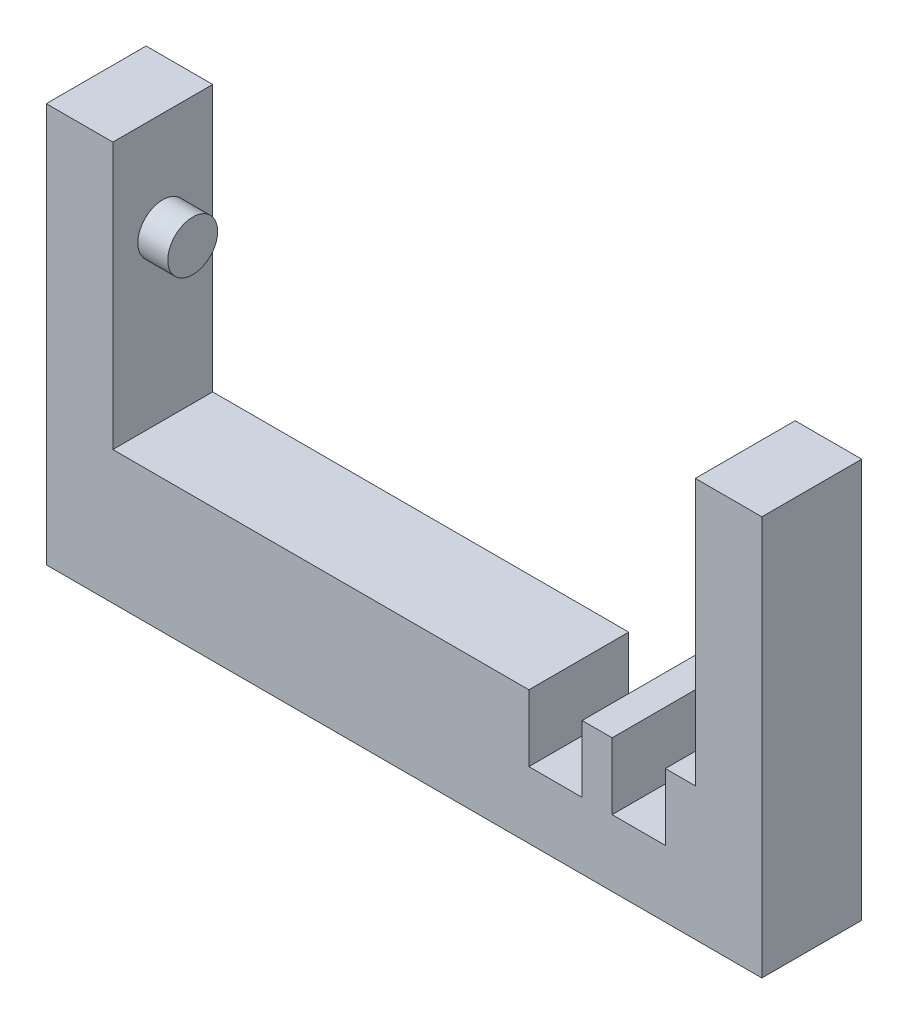
ISO-10303-21;
HEADER;
FILE_DESCRIPTION(('STEP AP214'),'2;1');
FILE_NAME('part.step','',(''),(''),'','','');
FILE_SCHEMA(('AUTOMOTIVE_DESIGN { 1 0 10303 214 1 1 1 1 }'));
ENDSEC;
DATA;
#1=APPLICATION_CONTEXT('core data for automotive mechanical design processes');
#2=APPLICATION_PROTOCOL_DEFINITION('international standard','automotive_design',2000,#1);
#3=PRODUCT_CONTEXT('',#1,'mechanical');
#4=PRODUCT('Part','Part','',(#3));
#5=PRODUCT_RELATED_PRODUCT_CATEGORY('part','',(#4));
#6=PRODUCT_DEFINITION_FORMATION('','',#4);
#7=PRODUCT_DEFINITION_CONTEXT('part definition',#1,'design');
#8=PRODUCT_DEFINITION('design','',#6,#7);
#9=PRODUCT_DEFINITION_SHAPE('','',#8);
#10=(LENGTH_UNIT() NAMED_UNIT(*) SI_UNIT(.MILLI.,.METRE.));
#11=(NAMED_UNIT(*) PLANE_ANGLE_UNIT() SI_UNIT($,.RADIAN.));
#12=(NAMED_UNIT(*) SI_UNIT($,.STERADIAN.) SOLID_ANGLE_UNIT());
#13=UNCERTAINTY_MEASURE_WITH_UNIT(LENGTH_MEASURE(1.E-05),#10,'distance_accuracy_value','');
#14=(GEOMETRIC_REPRESENTATION_CONTEXT(3) GLOBAL_UNCERTAINTY_ASSIGNED_CONTEXT((#13)) GLOBAL_UNIT_ASSIGNED_CONTEXT((#10,
#11,#12)) REPRESENTATION_CONTEXT('',''));
#15=CARTESIAN_POINT('',(0.,0.,0.));
#16=DIRECTION('',(0.,0.,1.));
#17=DIRECTION('',(1.,0.,0.));
#18=AXIS2_PLACEMENT_3D('',#15,#16,#17);
#19=CARTESIAN_POINT('',(0.,10.,-7.5));
#20=DIRECTION('',(0.,0.,-1.));
#21=DIRECTION('',(-1.,0.,0.));
#22=AXIS2_PLACEMENT_3D('',#19,#20,#21);
#23=PLANE('',#22);
#24=DIRECTION('',(-1.,0.,0.));
#25=VECTOR('',#24,1.);
#26=CARTESIAN_POINT('',(33.5,15.,-7.5));
#27=LINE('',#26,#25);
#28=CARTESIAN_POINT('',(33.5,15.,-7.5));
#29=VERTEX_POINT('',#28);
#30=CARTESIAN_POINT('',(29.,15.,-7.5));
#31=VERTEX_POINT('',#30);
#32=EDGE_CURVE('E57',#29,#31,#27,.T.);
#33=ORIENTED_EDGE('',*,*,#32,.F.);
#34=DIRECTION('',(0.,-1.,0.));
#35=VECTOR('',#34,1.);
#36=CARTESIAN_POINT('',(33.5,20.,-7.5));
#37=LINE('',#36,#35);
#38=CARTESIAN_POINT('',(33.5,10.,-7.5));
#39=VERTEX_POINT('',#38);
#40=EDGE_CURVE('E290',#29,#39,#37,.T.);
#41=ORIENTED_EDGE('',*,*,#40,.T.);
#42=DIRECTION('',(1.,0.,0.));
#43=VECTOR('',#42,1.);
#44=CARTESIAN_POINT('',(0.,10.,-7.5));
#45=LINE('',#44,#43);
#46=CARTESIAN_POINT('',(41.5,10.,-7.5));
#47=VERTEX_POINT('',#46);
#48=EDGE_CURVE('E303',#39,#47,#45,.T.);
#49=ORIENTED_EDGE('',*,*,#48,.T.);
#50=DIRECTION('',(0.,-1.,0.));
#51=VECTOR('',#50,1.);
#52=CARTESIAN_POINT('',(41.5,20.,-7.5));
#53=LINE('',#52,#51);
#54=CARTESIAN_POINT('',(41.5,20.,-7.5));
#55=VERTEX_POINT('',#54);
#56=EDGE_CURVE('E256',#55,#47,#53,.T.);
#57=ORIENTED_EDGE('',*,*,#56,.F.);
#58=DIRECTION('',(1.,0.,0.));
#59=VECTOR('',#58,1.);
#60=CARTESIAN_POINT('',(0.,20.,-7.49999999999995));
#61=LINE('',#60,#59);
#62=CARTESIAN_POINT('',(46.,20.,-7.5));
#63=VERTEX_POINT('',#62);
#64=EDGE_CURVE('E248',#55,#63,#61,.T.);
#65=ORIENTED_EDGE('',*,*,#64,.T.);
#66=DIRECTION('',(0.,-1.,0.));
#67=VECTOR('',#66,1.);
#68=CARTESIAN_POINT('',(46.,60.,-7.5));
#69=LINE('',#68,#67);
#70=CARTESIAN_POINT('',(46.,60.,-7.5));
#71=VERTEX_POINT('',#70);
#72=EDGE_CURVE('E215',#71,#63,#69,.T.);
#73=ORIENTED_EDGE('',*,*,#72,.F.);
#74=DIRECTION('',(1.,0.,0.));
#75=VECTOR('',#74,1.);
#76=CARTESIAN_POINT('',(0.,60.,-7.50000000000001));
#77=LINE('',#76,#75);
#78=CARTESIAN_POINT('',(56.,60.,-7.5));
#79=VERTEX_POINT('',#78);
#80=EDGE_CURVE('E207',#71,#79,#77,.T.);
#81=ORIENTED_EDGE('',*,*,#80,.T.);
#82=DIRECTION('',(0.,-1.,0.));
#83=VECTOR('',#82,1.);
#84=CARTESIAN_POINT('',(56.,60.,-7.5));
#85=LINE('',#84,#83);
#86=CARTESIAN_POINT('',(56.,0.,-7.5));
#87=VERTEX_POINT('',#86);
#88=EDGE_CURVE('E218',#79,#87,#85,.T.);
#89=ORIENTED_EDGE('',*,*,#88,.T.);
#90=DIRECTION('',(1.,0.,0.));
#91=VECTOR('',#90,1.);
#92=CARTESIAN_POINT('',(0.,0.,-7.5));
#93=LINE('',#92,#91);
#94=CARTESIAN_POINT('',(-51.5,0.,-7.5));
#95=VERTEX_POINT('',#94);
#96=EDGE_CURVE('E299',#95,#87,#93,.T.);
#97=ORIENTED_EDGE('',*,*,#96,.F.);
#98=DIRECTION('',(0.,-1.,0.));
#99=VECTOR('',#98,1.);
#100=CARTESIAN_POINT('',(-51.5,60.,-7.5));
#101=LINE('',#100,#99);
#102=CARTESIAN_POINT('',(-51.5,60.,-7.5));
#103=VERTEX_POINT('',#102);
#104=EDGE_CURVE('E361',#103,#95,#101,.T.);
#105=ORIENTED_EDGE('',*,*,#104,.F.);
#106=DIRECTION('',(-1.,0.,0.));
#107=VECTOR('',#106,1.);
#108=CARTESIAN_POINT('',(0.,60.,-7.5));
#109=LINE('',#108,#107);
#110=CARTESIAN_POINT('',(-41.5,60.,-7.5));
#111=VERTEX_POINT('',#110);
#112=EDGE_CURVE('E185',#111,#103,#109,.T.);
#113=ORIENTED_EDGE('',*,*,#112,.F.);
#114=DIRECTION('',(0.,-1.,0.));
#115=VECTOR('',#114,1.);
#116=CARTESIAN_POINT('',(-41.5,60.,-7.5));
#117=LINE('',#116,#115);
#118=CARTESIAN_POINT('',(-41.5,20.,-7.5));
#119=VERTEX_POINT('',#118);
#120=EDGE_CURVE('E198',#111,#119,#117,.T.);
#121=ORIENTED_EDGE('',*,*,#120,.T.);
#122=DIRECTION('',(1.,0.,0.));
#123=VECTOR('',#122,1.);
#124=CARTESIAN_POINT('',(0.,20.,-7.5));
#125=LINE('',#124,#123);
#126=CARTESIAN_POINT('',(21.,20.,-7.5));
#127=VERTEX_POINT('',#126);
#128=EDGE_CURVE('E262',#119,#127,#125,.T.);
#129=ORIENTED_EDGE('',*,*,#128,.T.);
#130=DIRECTION('',(0.,-1.,0.));
#131=VECTOR('',#130,1.);
#132=CARTESIAN_POINT('',(21.,20.,-7.5));
#133=LINE('',#132,#131);
#134=CARTESIAN_POINT('',(21.,10.,-7.5));
#135=VERTEX_POINT('',#134);
#136=EDGE_CURVE('E272',#127,#135,#133,.T.);
#137=ORIENTED_EDGE('',*,*,#136,.T.);
#138=DIRECTION('',(1.,0.,0.));
#139=VECTOR('',#138,1.);
#140=CARTESIAN_POINT('',(0.,10.,-7.5));
#141=LINE('',#140,#139);
#142=CARTESIAN_POINT('',(29.,10.,-7.5));
#143=VERTEX_POINT('',#142);
#144=EDGE_CURVE('E275',#135,#143,#141,.T.);
#145=ORIENTED_EDGE('',*,*,#144,.T.);
#146=DIRECTION('',(0.,-1.,0.));
#147=VECTOR('',#146,1.);
#148=CARTESIAN_POINT('',(29.,20.,-7.5));
#149=LINE('',#148,#147);
#150=EDGE_CURVE('E297',#31,#143,#149,.T.);
#151=ORIENTED_EDGE('',*,*,#150,.F.);
#152=EDGE_LOOP('',(#33,#41,#49,#57,#65,#73,#81,#89,#97,#105,#113,#121,#129,#137,#145,#151));
#153=FACE_BOUND('',#152,.T.);
#154=ADVANCED_FACE('F41',(#153),#23,.T.);
#155=CARTESIAN_POINT('',(0.,10.,7.5));
#156=DIRECTION('',(0.,0.,-1.));
#157=DIRECTION('',(-1.,0.,0.));
#158=AXIS2_PLACEMENT_3D('',#155,#156,#157);
#159=PLANE('',#158);
#160=DIRECTION('',(1.,0.,0.));
#161=VECTOR('',#160,1.);
#162=CARTESIAN_POINT('',(0.,0.,7.5));
#163=LINE('',#162,#161);
#164=CARTESIAN_POINT('',(-51.5,0.,7.5));
#165=VERTEX_POINT('',#164);
#166=CARTESIAN_POINT('',(56.,0.,7.5));
#167=VERTEX_POINT('',#166);
#168=EDGE_CURVE('E304',#165,#167,#163,.T.);
#169=ORIENTED_EDGE('',*,*,#168,.T.);
#170=DIRECTION('',(0.,-1.,0.));
#171=VECTOR('',#170,1.);
#172=CARTESIAN_POINT('',(56.,60.,7.5));
#173=LINE('',#172,#171);
#174=CARTESIAN_POINT('',(56.,60.,7.5));
#175=VERTEX_POINT('',#174);
#176=EDGE_CURVE('E221',#175,#167,#173,.T.);
#177=ORIENTED_EDGE('',*,*,#176,.F.);
#178=DIRECTION('',(-1.,0.,0.));
#179=VECTOR('',#178,1.);
#180=CARTESIAN_POINT('',(0.,60.,7.50000000000001));
#181=LINE('',#180,#179);
#182=CARTESIAN_POINT('',(46.,60.,7.5));
#183=VERTEX_POINT('',#182);
#184=EDGE_CURVE('E196',#175,#183,#181,.T.);
#185=ORIENTED_EDGE('',*,*,#184,.T.);
#186=DIRECTION('',(0.,-1.,0.));
#187=VECTOR('',#186,1.);
#188=CARTESIAN_POINT('',(46.,60.,7.5));
#189=LINE('',#188,#187);
#190=CARTESIAN_POINT('',(46.,20.,7.5));
#191=VERTEX_POINT('',#190);
#192=EDGE_CURVE('E211',#183,#191,#189,.T.);
#193=ORIENTED_EDGE('',*,*,#192,.T.);
#194=DIRECTION('',(-1.,0.,0.));
#195=VECTOR('',#194,1.);
#196=CARTESIAN_POINT('',(0.,20.,7.5));
#197=LINE('',#196,#195);
#198=CARTESIAN_POINT('',(41.5,20.,7.5));
#199=VERTEX_POINT('',#198);
#200=EDGE_CURVE('E242',#191,#199,#197,.T.);
#201=ORIENTED_EDGE('',*,*,#200,.T.);
#202=DIRECTION('',(0.,-1.,0.));
#203=VECTOR('',#202,1.);
#204=CARTESIAN_POINT('',(41.5,20.,7.5));
#205=LINE('',#204,#203);
#206=CARTESIAN_POINT('',(41.5,10.,7.5));
#207=VERTEX_POINT('',#206);
#208=EDGE_CURVE('E253',#199,#207,#205,.T.);
#209=ORIENTED_EDGE('',*,*,#208,.T.);
#210=DIRECTION('',(1.,0.,0.));
#211=VECTOR('',#210,1.);
#212=CARTESIAN_POINT('',(0.,10.,7.5));
#213=LINE('',#212,#211);
#214=CARTESIAN_POINT('',(33.5,10.,7.5));
#215=VERTEX_POINT('',#214);
#216=EDGE_CURVE('E11',#215,#207,#213,.T.);
#217=ORIENTED_EDGE('',*,*,#216,.F.);
#218=DIRECTION('',(0.,-1.,0.));
#219=VECTOR('',#218,1.);
#220=CARTESIAN_POINT('',(33.5,20.,7.5));
#221=LINE('',#220,#219);
#222=CARTESIAN_POINT('',(33.5,20.,7.5));
#223=VERTEX_POINT('',#222);
#224=EDGE_CURVE('E292',#223,#215,#221,.T.);
#225=ORIENTED_EDGE('',*,*,#224,.F.);
#226=DIRECTION('',(1.,0.,0.));
#227=VECTOR('',#226,1.);
#228=CARTESIAN_POINT('',(0.,20.,7.5));
#229=LINE('',#228,#227);
#230=CARTESIAN_POINT('',(29.,20.,7.5));
#231=VERTEX_POINT('',#230);
#232=EDGE_CURVE('E285',#231,#223,#229,.T.);
#233=ORIENTED_EDGE('',*,*,#232,.F.);
#234=DIRECTION('',(0.,-1.,0.));
#235=VECTOR('',#234,1.);
#236=CARTESIAN_POINT('',(29.,20.,7.5));
#237=LINE('',#236,#235);
#238=CARTESIAN_POINT('',(29.,10.,7.5));
#239=VERTEX_POINT('',#238);
#240=EDGE_CURVE('E294',#231,#239,#237,.T.);
#241=ORIENTED_EDGE('',*,*,#240,.T.);
#242=DIRECTION('',(1.,0.,0.));
#243=VECTOR('',#242,1.);
#244=CARTESIAN_POINT('',(0.,10.,7.5));
#245=LINE('',#244,#243);
#246=CARTESIAN_POINT('',(21.,10.,7.5));
#247=VERTEX_POINT('',#246);
#248=EDGE_CURVE('E65',#247,#239,#245,.T.);
#249=ORIENTED_EDGE('',*,*,#248,.F.);
#250=DIRECTION('',(0.,-1.,0.));
#251=VECTOR('',#250,1.);
#252=CARTESIAN_POINT('',(21.,20.,7.5));
#253=LINE('',#252,#251);
#254=CARTESIAN_POINT('',(21.,20.,7.5));
#255=VERTEX_POINT('',#254);
#256=EDGE_CURVE('E270',#255,#247,#253,.T.);
#257=ORIENTED_EDGE('',*,*,#256,.F.);
#258=DIRECTION('',(1.,0.,0.));
#259=VECTOR('',#258,1.);
#260=CARTESIAN_POINT('',(0.,20.,7.5));
#261=LINE('',#260,#259);
#262=CARTESIAN_POINT('',(-41.5,20.,7.5));
#263=VERTEX_POINT('',#262);
#264=EDGE_CURVE('E268',#263,#255,#261,.T.);
#265=ORIENTED_EDGE('',*,*,#264,.F.);
#266=DIRECTION('',(0.,-1.,0.));
#267=VECTOR('',#266,1.);
#268=CARTESIAN_POINT('',(-41.5,60.,7.5));
#269=LINE('',#268,#267);
#270=CARTESIAN_POINT('',(-41.5,60.,7.5));
#271=VERTEX_POINT('',#270);
#272=EDGE_CURVE('E175',#271,#263,#269,.T.);
#273=ORIENTED_EDGE('',*,*,#272,.F.);
#274=DIRECTION('',(1.,0.,0.));
#275=VECTOR('',#274,1.);
#276=CARTESIAN_POINT('',(0.,60.,7.5));
#277=LINE('',#276,#275);
#278=CARTESIAN_POINT('',(-51.5,60.,7.5));
#279=VERTEX_POINT('',#278);
#280=EDGE_CURVE('E168',#279,#271,#277,.T.);
#281=ORIENTED_EDGE('',*,*,#280,.F.);
#282=DIRECTION('',(0.,-1.,0.));
#283=VECTOR('',#282,1.);
#284=CARTESIAN_POINT('',(-51.5,60.,7.5));
#285=LINE('',#284,#283);
#286=EDGE_CURVE('E172',#279,#165,#285,.T.);
#287=ORIENTED_EDGE('',*,*,#286,.T.);
#288=EDGE_LOOP('',(#169,#177,#185,#193,#201,#209,#217,#225,#233,#241,#249,#257,#265,#273,#281,#287));
#289=FACE_BOUND('',#288,.T.);
#290=ADVANCED_FACE('F170',(#289),#159,.F.);
#291=CARTESIAN_POINT('',(0.,10.,0.));
#292=DIRECTION('',(0.,1.,0.));
#293=DIRECTION('',(0.,0.,1.));
#294=AXIS2_PLACEMENT_3D('',#291,#292,#293);
#295=PLANE('',#294);
#296=DIRECTION('',(0.,0.,1.));
#297=VECTOR('',#296,1.);
#298=CARTESIAN_POINT('',(41.5,10.,0.));
#299=LINE('',#298,#297);
#300=EDGE_CURVE('E300',#47,#207,#299,.T.);
#301=ORIENTED_EDGE('',*,*,#300,.F.);
#302=ORIENTED_EDGE('',*,*,#48,.F.);
#303=DIRECTION('',(0.,0.,1.));
#304=VECTOR('',#303,1.);
#305=CARTESIAN_POINT('',(33.5,10.,0.));
#306=LINE('',#305,#304);
#307=EDGE_CURVE('E49',#39,#215,#306,.T.);
#308=ORIENTED_EDGE('',*,*,#307,.T.);
#309=ORIENTED_EDGE('',*,*,#216,.T.);
#310=EDGE_LOOP('',(#301,#302,#308,#309));
#311=FACE_BOUND('',#310,.T.);
#312=ADVANCED_FACE('F335',(#311),#295,.T.);
#313=CARTESIAN_POINT('',(0.,0.,0.));
#314=DIRECTION('',(0.,1.,0.));
#315=DIRECTION('',(0.,0.,1.));
#316=AXIS2_PLACEMENT_3D('',#313,#314,#315);
#317=PLANE('',#316);
#318=ORIENTED_EDGE('',*,*,#96,.T.);
#319=DIRECTION('',(0.,0.,1.));
#320=VECTOR('',#319,1.);
#321=CARTESIAN_POINT('',(56.,0.,0.));
#322=LINE('',#321,#320);
#323=EDGE_CURVE('E193',#87,#167,#322,.T.);
#324=ORIENTED_EDGE('',*,*,#323,.T.);
#325=ORIENTED_EDGE('',*,*,#168,.F.);
#326=DIRECTION('',(0.,0.,1.));
#327=VECTOR('',#326,1.);
#328=CARTESIAN_POINT('',(-51.5,0.,0.));
#329=LINE('',#328,#327);
#330=EDGE_CURVE('E189',#95,#165,#329,.T.);
#331=ORIENTED_EDGE('',*,*,#330,.F.);
#332=EDGE_LOOP('',(#318,#324,#325,#331));
#333=FACE_BOUND('',#332,.T.);
#334=ADVANCED_FACE('F315',(#333),#317,.F.);
#335=CARTESIAN_POINT('',(33.5,20.,0.));
#336=DIRECTION('',(1.,0.,0.));
#337=DIRECTION('',(0.,0.,-1.));
#338=AXIS2_PLACEMENT_3D('',#335,#336,#337);
#339=PLANE('',#338);
#340=CARTESIAN_POINT('',(33.5,17.5,-10.));
#341=DIRECTION('',(1.,0.,0.));
#342=DIRECTION('',(0.,0.,-1.));
#343=AXIS2_PLACEMENT_3D('',#340,#341,#342);
#344=CIRCLE('',#343,1.5);
#345=CARTESIAN_POINT('',(33.5,17.5,-11.5));
#346=VERTEX_POINT('',#345);
#347=EDGE_CURVE('E373',#346,#346,#344,.T.);
#348=ORIENTED_EDGE('',*,*,#347,.F.);
#349=EDGE_LOOP('',(#348));
#350=FACE_BOUND('',#349,.T.);
#351=ORIENTED_EDGE('',*,*,#307,.F.);
#352=ORIENTED_EDGE('',*,*,#40,.F.);
#353=DIRECTION('',(0.,0.,1.));
#354=VECTOR('',#353,1.);
#355=CARTESIAN_POINT('',(33.5,15.,-12.5));
#356=LINE('',#355,#354);
#357=CARTESIAN_POINT('',(33.5,15.,-12.5));
#358=VERTEX_POINT('',#357);
#359=EDGE_CURVE('E239',#358,#29,#356,.T.);
#360=ORIENTED_EDGE('',*,*,#359,.F.);
#361=DIRECTION('',(0.,-1.,0.));
#362=VECTOR('',#361,1.);
#363=CARTESIAN_POINT('',(33.5,20.,-12.5));
#364=LINE('',#363,#362);
#365=CARTESIAN_POINT('',(33.5,20.,-12.5));
#366=VERTEX_POINT('',#365);
#367=EDGE_CURVE('E224',#366,#358,#364,.T.);
#368=ORIENTED_EDGE('',*,*,#367,.F.);
#369=DIRECTION('',(0.,0.,1.));
#370=VECTOR('',#369,1.);
#371=CARTESIAN_POINT('',(33.5,20.,0.));
#372=LINE('',#371,#370);
#373=EDGE_CURVE('E287',#366,#223,#372,.T.);
#374=ORIENTED_EDGE('',*,*,#373,.T.);
#375=ORIENTED_EDGE('',*,*,#224,.T.);
#376=EDGE_LOOP('',(#351,#352,#360,#368,#374,#375));
#377=FACE_BOUND('',#376,.T.);
#378=ADVANCED_FACE('F338',(#350,#377),#339,.T.);
#379=CARTESIAN_POINT('',(29.,20.,0.));
#380=DIRECTION('',(1.,0.,0.));
#381=DIRECTION('',(0.,0.,-1.));
#382=AXIS2_PLACEMENT_3D('',#379,#380,#381);
#383=PLANE('',#382);
#384=CARTESIAN_POINT('',(29.,17.5,-10.));
#385=DIRECTION('',(1.,0.,0.));
#386=DIRECTION('',(0.,0.,-1.));
#387=AXIS2_PLACEMENT_3D('',#384,#385,#386);
#388=CIRCLE('',#387,1.5);
#389=CARTESIAN_POINT('',(29.,17.5,-11.5));
#390=VERTEX_POINT('',#389);
#391=EDGE_CURVE('E44',#390,#390,#388,.T.);
#392=ORIENTED_EDGE('',*,*,#391,.T.);
#393=EDGE_LOOP('',(#392));
#394=FACE_BOUND('',#393,.T.);
#395=DIRECTION('',(0.,0.,1.));
#396=VECTOR('',#395,1.);
#397=CARTESIAN_POINT('',(29.,20.,0.));
#398=LINE('',#397,#396);
#399=CARTESIAN_POINT('',(29.,20.,-12.5));
#400=VERTEX_POINT('',#399);
#401=EDGE_CURVE('E283',#400,#231,#398,.T.);
#402=ORIENTED_EDGE('',*,*,#401,.F.);
#403=DIRECTION('',(0.,1.,0.));
#404=VECTOR('',#403,1.);
#405=CARTESIAN_POINT('',(29.,20.,-12.5));
#406=LINE('',#405,#404);
#407=CARTESIAN_POINT('',(29.,15.,-12.5));
#408=VERTEX_POINT('',#407);
#409=EDGE_CURVE('E229',#408,#400,#406,.T.);
#410=ORIENTED_EDGE('',*,*,#409,.F.);
#411=DIRECTION('',(0.,0.,1.));
#412=VECTOR('',#411,1.);
#413=CARTESIAN_POINT('',(29.,15.,-12.5));
#414=LINE('',#413,#412);
#415=EDGE_CURVE('E235',#408,#31,#414,.T.);
#416=ORIENTED_EDGE('',*,*,#415,.T.);
#417=ORIENTED_EDGE('',*,*,#150,.T.);
#418=DIRECTION('',(0.,0.,1.));
#419=VECTOR('',#418,1.);
#420=CARTESIAN_POINT('',(29.,10.,0.));
#421=LINE('',#420,#419);
#422=EDGE_CURVE('E281',#143,#239,#421,.T.);
#423=ORIENTED_EDGE('',*,*,#422,.T.);
#424=ORIENTED_EDGE('',*,*,#240,.F.);
#425=EDGE_LOOP('',(#402,#410,#416,#417,#423,#424));
#426=FACE_BOUND('',#425,.T.);
#427=ADVANCED_FACE('F349',(#394,#426),#383,.F.);
#428=CARTESIAN_POINT('',(0.,20.,0.));
#429=DIRECTION('',(0.,1.,0.));
#430=DIRECTION('',(0.,0.,1.));
#431=AXIS2_PLACEMENT_3D('',#428,#429,#430);
#432=PLANE('',#431);
#433=ORIENTED_EDGE('',*,*,#373,.F.);
#434=DIRECTION('',(1.,0.,0.));
#435=VECTOR('',#434,1.);
#436=CARTESIAN_POINT('',(33.5,20.,-12.5));
#437=LINE('',#436,#435);
#438=EDGE_CURVE('E232',#400,#366,#437,.T.);
#439=ORIENTED_EDGE('',*,*,#438,.F.);
#440=ORIENTED_EDGE('',*,*,#401,.T.);
#441=ORIENTED_EDGE('',*,*,#232,.T.);
#442=EDGE_LOOP('',(#433,#439,#440,#441));
#443=FACE_BOUND('',#442,.T.);
#444=ADVANCED_FACE('F343',(#443),#432,.T.);
#445=CARTESIAN_POINT('',(0.,10.,0.));
#446=DIRECTION('',(0.,1.,0.));
#447=DIRECTION('',(0.,0.,1.));
#448=AXIS2_PLACEMENT_3D('',#445,#446,#447);
#449=PLANE('',#448);
#450=ORIENTED_EDGE('',*,*,#144,.F.);
#451=DIRECTION('',(0.,0.,1.));
#452=VECTOR('',#451,1.);
#453=CARTESIAN_POINT('',(21.,10.,0.));
#454=LINE('',#453,#452);
#455=EDGE_CURVE('E278',#135,#247,#454,.T.);
#456=ORIENTED_EDGE('',*,*,#455,.T.);
#457=ORIENTED_EDGE('',*,*,#248,.T.);
#458=ORIENTED_EDGE('',*,*,#422,.F.);
#459=EDGE_LOOP('',(#450,#456,#457,#458));
#460=FACE_BOUND('',#459,.T.);
#461=ADVANCED_FACE('F409',(#460),#449,.T.);
#462=CARTESIAN_POINT('',(21.,20.,0.));
#463=DIRECTION('',(1.,0.,0.));
#464=DIRECTION('',(0.,0.,-1.));
#465=AXIS2_PLACEMENT_3D('',#462,#463,#464);
#466=PLANE('',#465);
#467=ORIENTED_EDGE('',*,*,#455,.F.);
#468=ORIENTED_EDGE('',*,*,#136,.F.);
#469=DIRECTION('',(0.,0.,1.));
#470=VECTOR('',#469,1.);
#471=CARTESIAN_POINT('',(21.,20.,0.));
#472=LINE('',#471,#470);
#473=EDGE_CURVE('E259',#127,#255,#472,.T.);
#474=ORIENTED_EDGE('',*,*,#473,.T.);
#475=ORIENTED_EDGE('',*,*,#256,.T.);
#476=EDGE_LOOP('',(#467,#468,#474,#475));
#477=FACE_BOUND('',#476,.T.);
#478=ADVANCED_FACE('F354',(#477),#466,.T.);
#479=CARTESIAN_POINT('',(0.,20.,0.));
#480=DIRECTION('',(0.,1.,0.));
#481=DIRECTION('',(0.,0.,1.));
#482=AXIS2_PLACEMENT_3D('',#479,#480,#481);
#483=PLANE('',#482);
#484=ORIENTED_EDGE('',*,*,#473,.F.);
#485=ORIENTED_EDGE('',*,*,#128,.F.);
#486=DIRECTION('',(0.,0.,1.));
#487=VECTOR('',#486,1.);
#488=CARTESIAN_POINT('',(-41.5,20.,0.));
#489=LINE('',#488,#487);
#490=EDGE_CURVE('E265',#119,#263,#489,.T.);
#491=ORIENTED_EDGE('',*,*,#490,.T.);
#492=ORIENTED_EDGE('',*,*,#264,.T.);
#493=EDGE_LOOP('',(#484,#485,#491,#492));
#494=FACE_BOUND('',#493,.T.);
#495=ADVANCED_FACE('F357',(#494),#483,.T.);
#496=CARTESIAN_POINT('',(41.5,20.,0.));
#497=DIRECTION('',(1.,0.,0.));
#498=DIRECTION('',(0.,0.,-1.));
#499=AXIS2_PLACEMENT_3D('',#496,#497,#498);
#500=PLANE('',#499);
#501=ORIENTED_EDGE('',*,*,#56,.T.);
#502=ORIENTED_EDGE('',*,*,#300,.T.);
#503=ORIENTED_EDGE('',*,*,#208,.F.);
#504=DIRECTION('',(0.,0.,1.));
#505=VECTOR('',#504,1.);
#506=CARTESIAN_POINT('',(41.5,20.,0.));
#507=LINE('',#506,#505);
#508=EDGE_CURVE('E251',#55,#199,#507,.T.);
#509=ORIENTED_EDGE('',*,*,#508,.F.);
#510=EDGE_LOOP('',(#501,#502,#503,#509));
#511=FACE_BOUND('',#510,.T.);
#512=ADVANCED_FACE('F330',(#511),#500,.F.);
#513=CARTESIAN_POINT('',(0.,20.,0.));
#514=DIRECTION('',(0.,1.,0.));
#515=DIRECTION('',(0.,0.,1.));
#516=AXIS2_PLACEMENT_3D('',#513,#514,#515);
#517=PLANE('',#516);
#518=ORIENTED_EDGE('',*,*,#200,.F.);
#519=DIRECTION('',(0.,0.,1.));
#520=VECTOR('',#519,1.);
#521=CARTESIAN_POINT('',(46.,20.,0.));
#522=LINE('',#521,#520);
#523=EDGE_CURVE('E245',#63,#191,#522,.T.);
#524=ORIENTED_EDGE('',*,*,#523,.F.);
#525=ORIENTED_EDGE('',*,*,#64,.F.);
#526=ORIENTED_EDGE('',*,*,#508,.T.);
#527=EDGE_LOOP('',(#518,#524,#525,#526));
#528=FACE_BOUND('',#527,.T.);
#529=ADVANCED_FACE('F325',(#528),#517,.T.);
#530=CARTESIAN_POINT('',(33.5,15.,-12.5));
#531=DIRECTION('',(0.,1.,0.));
#532=DIRECTION('',(0.,0.,1.));
#533=AXIS2_PLACEMENT_3D('',#530,#531,#532);
#534=PLANE('',#533);
#535=ORIENTED_EDGE('',*,*,#32,.T.);
#536=ORIENTED_EDGE('',*,*,#415,.F.);
#537=DIRECTION('',(-1.,0.,0.));
#538=VECTOR('',#537,1.);
#539=CARTESIAN_POINT('',(33.5,15.,-12.5));
#540=LINE('',#539,#538);
#541=EDGE_CURVE('E227',#358,#408,#540,.T.);
#542=ORIENTED_EDGE('',*,*,#541,.F.);
#543=ORIENTED_EDGE('',*,*,#359,.T.);
#544=EDGE_LOOP('',(#535,#536,#542,#543));
#545=FACE_BOUND('',#544,.T.);
#546=ADVANCED_FACE('F420',(#545),#534,.F.);
#547=CARTESIAN_POINT('',(0.,0.,-12.5));
#548=DIRECTION('',(0.,0.,-1.));
#549=DIRECTION('',(-1.,0.,0.));
#550=AXIS2_PLACEMENT_3D('',#547,#548,#549);
#551=PLANE('',#550);
#552=ORIENTED_EDGE('',*,*,#367,.T.);
#553=ORIENTED_EDGE('',*,*,#541,.T.);
#554=ORIENTED_EDGE('',*,*,#409,.T.);
#555=ORIENTED_EDGE('',*,*,#438,.T.);
#556=EDGE_LOOP('',(#552,#553,#554,#555));
#557=FACE_BOUND('',#556,.T.);
#558=ADVANCED_FACE('F345',(#557),#551,.T.);
#559=CARTESIAN_POINT('',(46.,60.,0.));
#560=DIRECTION('',(1.,0.,0.));
#561=DIRECTION('',(0.,0.,-1.));
#562=AXIS2_PLACEMENT_3D('',#559,#560,#561);
#563=PLANE('',#562);
#564=ORIENTED_EDGE('',*,*,#72,.T.);
#565=ORIENTED_EDGE('',*,*,#523,.T.);
#566=ORIENTED_EDGE('',*,*,#192,.F.);
#567=DIRECTION('',(0.,0.,1.));
#568=VECTOR('',#567,1.);
#569=CARTESIAN_POINT('',(46.,60.,0.));
#570=LINE('',#569,#568);
#571=EDGE_CURVE('E210',#71,#183,#570,.T.);
#572=ORIENTED_EDGE('',*,*,#571,.F.);
#573=EDGE_LOOP('',(#564,#565,#566,#572));
#574=FACE_BOUND('',#573,.T.);
#575=ADVANCED_FACE('F322',(#574),#563,.F.);
#576=CARTESIAN_POINT('',(56.,60.,0.));
#577=DIRECTION('',(1.,0.,0.));
#578=DIRECTION('',(0.,0.,-1.));
#579=AXIS2_PLACEMENT_3D('',#576,#577,#578);
#580=PLANE('',#579);
#581=ORIENTED_EDGE('',*,*,#323,.F.);
#582=ORIENTED_EDGE('',*,*,#88,.F.);
#583=DIRECTION('',(0.,0.,1.));
#584=VECTOR('',#583,1.);
#585=CARTESIAN_POINT('',(56.,60.,0.));
#586=LINE('',#585,#584);
#587=EDGE_CURVE('E204',#79,#175,#586,.T.);
#588=ORIENTED_EDGE('',*,*,#587,.T.);
#589=ORIENTED_EDGE('',*,*,#176,.T.);
#590=EDGE_LOOP('',(#581,#582,#588,#589));
#591=FACE_BOUND('',#590,.T.);
#592=ADVANCED_FACE('F313',(#591),#580,.T.);
#593=CARTESIAN_POINT('',(0.,60.,0.));
#594=DIRECTION('',(0.,1.,0.));
#595=DIRECTION('',(0.,0.,1.));
#596=AXIS2_PLACEMENT_3D('',#593,#594,#595);
#597=PLANE('',#596);
#598=ORIENTED_EDGE('',*,*,#184,.F.);
#599=ORIENTED_EDGE('',*,*,#587,.F.);
#600=ORIENTED_EDGE('',*,*,#80,.F.);
#601=ORIENTED_EDGE('',*,*,#571,.T.);
#602=EDGE_LOOP('',(#598,#599,#600,#601));
#603=FACE_BOUND('',#602,.T.);
#604=ADVANCED_FACE('F318',(#603),#597,.T.);
#605=CARTESIAN_POINT('',(-41.5,60.,0.));
#606=DIRECTION('',(1.,0.,0.));
#607=DIRECTION('',(0.,0.,-1.));
#608=AXIS2_PLACEMENT_3D('',#605,#606,#607);
#609=PLANE('',#608);
#610=CARTESIAN_POINT('',(-41.5,45.,0.));
#611=DIRECTION('',(1.,0.,0.));
#612=DIRECTION('',(0.,0.,-1.));
#613=AXIS2_PLACEMENT_3D('',#610,#611,#612);
#614=CIRCLE('',#613,3.75);
#615=CARTESIAN_POINT('',(-41.5,45.,-3.74999999999999));
#616=VERTEX_POINT('',#615);
#617=EDGE_CURVE('E368',#616,#616,#614,.T.);
#618=ORIENTED_EDGE('',*,*,#617,.F.);
#619=EDGE_LOOP('',(#618));
#620=FACE_BOUND('',#619,.T.);
#621=ORIENTED_EDGE('',*,*,#490,.F.);
#622=ORIENTED_EDGE('',*,*,#120,.F.);
#623=DIRECTION('',(0.,0.,1.));
#624=VECTOR('',#623,1.);
#625=CARTESIAN_POINT('',(-41.5,60.,0.));
#626=LINE('',#625,#624);
#627=EDGE_CURVE('E179',#111,#271,#626,.T.);
#628=ORIENTED_EDGE('',*,*,#627,.T.);
#629=ORIENTED_EDGE('',*,*,#272,.T.);
#630=EDGE_LOOP('',(#621,#622,#628,#629));
#631=FACE_BOUND('',#630,.T.);
#632=ADVANCED_FACE('F432',(#620,#631),#609,.T.);
#633=CARTESIAN_POINT('',(-51.5,60.,0.));
#634=DIRECTION('',(1.,0.,0.));
#635=DIRECTION('',(0.,0.,-1.));
#636=AXIS2_PLACEMENT_3D('',#633,#634,#635);
#637=PLANE('',#636);
#638=ORIENTED_EDGE('',*,*,#330,.T.);
#639=ORIENTED_EDGE('',*,*,#286,.F.);
#640=DIRECTION('',(0.,0.,1.));
#641=VECTOR('',#640,1.);
#642=CARTESIAN_POINT('',(-51.5,60.,0.));
#643=LINE('',#642,#641);
#644=EDGE_CURVE('E180',#103,#279,#643,.T.);
#645=ORIENTED_EDGE('',*,*,#644,.F.);
#646=ORIENTED_EDGE('',*,*,#104,.T.);
#647=EDGE_LOOP('',(#638,#639,#645,#646));
#648=FACE_BOUND('',#647,.T.);
#649=ADVANCED_FACE('F191',(#648),#637,.F.);
#650=CARTESIAN_POINT('',(0.,60.,0.));
#651=DIRECTION('',(0.,1.,0.));
#652=DIRECTION('',(0.,0.,1.));
#653=AXIS2_PLACEMENT_3D('',#650,#651,#652);
#654=PLANE('',#653);
#655=ORIENTED_EDGE('',*,*,#644,.T.);
#656=ORIENTED_EDGE('',*,*,#280,.T.);
#657=ORIENTED_EDGE('',*,*,#627,.F.);
#658=ORIENTED_EDGE('',*,*,#112,.T.);
#659=EDGE_LOOP('',(#655,#656,#657,#658));
#660=FACE_BOUND('',#659,.T.);
#661=ADVANCED_FACE('F183',(#660),#654,.T.);
#662=CARTESIAN_POINT('',(-37.,45.,0.));
#663=DIRECTION('',(-1.,0.,0.));
#664=DIRECTION('',(0.,0.,1.));
#665=AXIS2_PLACEMENT_3D('',#662,#663,#664);
#666=CYLINDRICAL_SURFACE('',#665,3.75);
#667=CARTESIAN_POINT('',(-37.,45.,0.));
#668=DIRECTION('',(1.,0.,0.));
#669=DIRECTION('',(0.,0.,-1.));
#670=AXIS2_PLACEMENT_3D('',#667,#668,#669);
#671=CIRCLE('',#670,3.75);
#672=CARTESIAN_POINT('',(-37.,45.,-3.74999999999999));
#673=VERTEX_POINT('',#672);
#674=EDGE_CURVE('E365',#673,#673,#671,.T.);
#675=ORIENTED_EDGE('',*,*,#674,.F.);
#676=EDGE_LOOP('',(#675));
#677=FACE_BOUND('',#676,.T.);
#678=ORIENTED_EDGE('',*,*,#617,.T.);
#679=EDGE_LOOP('',(#678));
#680=FACE_BOUND('',#679,.T.);
#681=ADVANCED_FACE('F388',(#677,#680),#666,.T.);
#682=CARTESIAN_POINT('',(-37.,45.,0.));
#683=DIRECTION('',(1.,0.,0.));
#684=DIRECTION('',(0.,0.,-1.));
#685=AXIS2_PLACEMENT_3D('',#682,#683,#684);
#686=PLANE('',#685);
#687=ORIENTED_EDGE('',*,*,#674,.T.);
#688=EDGE_LOOP('',(#687));
#689=FACE_BOUND('',#688,.T.);
#690=ADVANCED_FACE('F383',(#689),#686,.T.);
#691=CARTESIAN_POINT('',(28.5,17.5,-10.));
#692=DIRECTION('',(1.,0.,0.));
#693=DIRECTION('',(0.,0.,-1.));
#694=AXIS2_PLACEMENT_3D('',#691,#692,#693);
#695=CYLINDRICAL_SURFACE('',#694,1.5);
#696=ORIENTED_EDGE('',*,*,#347,.T.);
#697=EDGE_LOOP('',(#696));
#698=FACE_BOUND('',#697,.T.);
#699=ORIENTED_EDGE('',*,*,#391,.F.);
#700=EDGE_LOOP('',(#699));
#701=FACE_BOUND('',#700,.T.);
#702=ADVANCED_FACE('F381',(#698,#701),#695,.F.);
#703=CLOSED_SHELL('',(#154,#290,#312,#334,#378,#427,#444,#461,#478,#495,#512,#529,#546,#558,
#575,#592,#604,#632,#649,#661,#681,#690,#702));
#704=MANIFOLD_SOLID_BREP('B2',#703);
#705=ADVANCED_BREP_SHAPE_REPRESENTATION('',(#18,#704),#14);
#706=SHAPE_DEFINITION_REPRESENTATION(#9,#705);
ENDSEC;
END-ISO-10303-21;
